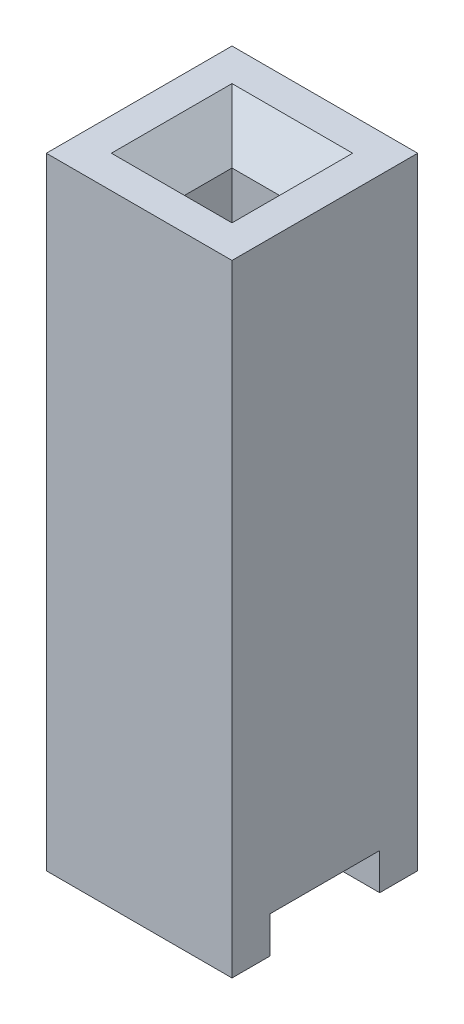
ISO-10303-21;
HEADER;
FILE_DESCRIPTION(('STEP AP214'),'2;1');
FILE_NAME('part.step','',(''),(''),'','','');
FILE_SCHEMA(('AUTOMOTIVE_DESIGN { 1 0 10303 214 1 1 1 1 }'));
ENDSEC;
DATA;
#1=APPLICATION_CONTEXT('core data for automotive mechanical design processes');
#2=APPLICATION_PROTOCOL_DEFINITION('international standard','automotive_design',2000,#1);
#3=PRODUCT_CONTEXT('',#1,'mechanical');
#4=PRODUCT('Part','Part','',(#3));
#5=PRODUCT_RELATED_PRODUCT_CATEGORY('part','',(#4));
#6=PRODUCT_DEFINITION_FORMATION('','',#4);
#7=PRODUCT_DEFINITION_CONTEXT('part definition',#1,'design');
#8=PRODUCT_DEFINITION('design','',#6,#7);
#9=PRODUCT_DEFINITION_SHAPE('','',#8);
#10=(LENGTH_UNIT() NAMED_UNIT(*) SI_UNIT(.MILLI.,.METRE.));
#11=(NAMED_UNIT(*) PLANE_ANGLE_UNIT() SI_UNIT($,.RADIAN.));
#12=(NAMED_UNIT(*) SI_UNIT($,.STERADIAN.) SOLID_ANGLE_UNIT());
#13=UNCERTAINTY_MEASURE_WITH_UNIT(LENGTH_MEASURE(1.E-05),#10,'distance_accuracy_value','');
#14=(GEOMETRIC_REPRESENTATION_CONTEXT(3) GLOBAL_UNCERTAINTY_ASSIGNED_CONTEXT((#13)) GLOBAL_UNIT_ASSIGNED_CONTEXT((#10,
#11,#12)) REPRESENTATION_CONTEXT('',''));
#15=CARTESIAN_POINT('',(0.,0.,0.));
#16=DIRECTION('',(0.,0.,1.));
#17=DIRECTION('',(1.,0.,0.));
#18=AXIS2_PLACEMENT_3D('',#15,#16,#17);
#19=CARTESIAN_POINT('',(-1.27,8.5,-1.27));
#20=DIRECTION('',(1.,0.,0.));
#21=DIRECTION('',(0.,0.,-1.));
#22=AXIS2_PLACEMENT_3D('',#19,#20,#21);
#23=PLANE('',#22);
#24=DIRECTION('',(0.,-1.,0.));
#25=VECTOR('',#24,1.);
#26=CARTESIAN_POINT('',(-1.27,8.5,-0.75));
#27=LINE('',#26,#25);
#28=CARTESIAN_POINT('',(-1.27,0.5,-0.75));
#29=VERTEX_POINT('',#28);
#30=CARTESIAN_POINT('',(-1.27,0.,-0.75));
#31=VERTEX_POINT('',#30);
#32=EDGE_CURVE('E200',#29,#31,#27,.T.);
#33=ORIENTED_EDGE('',*,*,#32,.F.);
#34=DIRECTION('',(0.,0.,1.));
#35=VECTOR('',#34,1.);
#36=CARTESIAN_POINT('',(-1.27,0.5,-1.27));
#37=LINE('',#36,#35);
#38=CARTESIAN_POINT('',(-1.27,0.5,0.75));
#39=VERTEX_POINT('',#38);
#40=EDGE_CURVE('E202',#29,#39,#37,.T.);
#41=ORIENTED_EDGE('',*,*,#40,.T.);
#42=DIRECTION('',(0.,1.,0.));
#43=VECTOR('',#42,1.);
#44=CARTESIAN_POINT('',(-1.27,8.5,0.75));
#45=LINE('',#44,#43);
#46=CARTESIAN_POINT('',(-1.27,0.,0.75));
#47=VERTEX_POINT('',#46);
#48=EDGE_CURVE('E195',#47,#39,#45,.T.);
#49=ORIENTED_EDGE('',*,*,#48,.F.);
#50=DIRECTION('',(0.,0.,1.));
#51=VECTOR('',#50,1.);
#52=CARTESIAN_POINT('',(-1.27,0.,-1.27));
#53=LINE('',#52,#51);
#54=CARTESIAN_POINT('',(-1.27,0.,1.27));
#55=VERTEX_POINT('',#54);
#56=EDGE_CURVE('E205',#47,#55,#53,.T.);
#57=ORIENTED_EDGE('',*,*,#56,.T.);
#58=DIRECTION('',(0.,-1.,0.));
#59=VECTOR('',#58,1.);
#60=CARTESIAN_POINT('',(-1.27,8.5,1.27));
#61=LINE('',#60,#59);
#62=CARTESIAN_POINT('',(-1.27,8.5,1.27));
#63=VERTEX_POINT('',#62);
#64=EDGE_CURVE('E237',#63,#55,#61,.T.);
#65=ORIENTED_EDGE('',*,*,#64,.F.);
#66=DIRECTION('',(0.,0.,1.));
#67=VECTOR('',#66,1.);
#68=CARTESIAN_POINT('',(-1.27,8.5,-1.27));
#69=LINE('',#68,#67);
#70=CARTESIAN_POINT('',(-1.27,8.5,-1.27));
#71=VERTEX_POINT('',#70);
#72=EDGE_CURVE('E206',#71,#63,#69,.T.);
#73=ORIENTED_EDGE('',*,*,#72,.F.);
#74=DIRECTION('',(0.,-1.,0.));
#75=VECTOR('',#74,1.);
#76=CARTESIAN_POINT('',(-1.27,8.5,-1.27));
#77=LINE('',#76,#75);
#78=CARTESIAN_POINT('',(-1.27,0.,-1.27));
#79=VERTEX_POINT('',#78);
#80=EDGE_CURVE('E218',#71,#79,#77,.T.);
#81=ORIENTED_EDGE('',*,*,#80,.T.);
#82=EDGE_CURVE('E219',#79,#31,#53,.T.);
#83=ORIENTED_EDGE('',*,*,#82,.T.);
#84=EDGE_LOOP('',(#33,#41,#49,#57,#65,#73,#81,#83));
#85=FACE_BOUND('',#84,.T.);
#86=ADVANCED_FACE('F51',(#85),#23,.F.);
#87=CARTESIAN_POINT('',(1.27,8.5,-1.27));
#88=DIRECTION('',(1.,0.,0.));
#89=DIRECTION('',(0.,0.,-1.));
#90=AXIS2_PLACEMENT_3D('',#87,#88,#89);
#91=PLANE('',#90);
#92=DIRECTION('',(0.,0.,1.));
#93=VECTOR('',#92,1.);
#94=CARTESIAN_POINT('',(1.27,0.5,-1.27));
#95=LINE('',#94,#93);
#96=CARTESIAN_POINT('',(1.27,0.5,-0.75));
#97=VERTEX_POINT('',#96);
#98=CARTESIAN_POINT('',(1.27,0.5,0.75));
#99=VERTEX_POINT('',#98);
#100=EDGE_CURVE('E244',#97,#99,#95,.T.);
#101=ORIENTED_EDGE('',*,*,#100,.F.);
#102=DIRECTION('',(0.,-1.,0.));
#103=VECTOR('',#102,1.);
#104=CARTESIAN_POINT('',(1.27,8.5,-0.75));
#105=LINE('',#104,#103);
#106=CARTESIAN_POINT('',(1.27,0.,-0.75));
#107=VERTEX_POINT('',#106);
#108=EDGE_CURVE('E197',#97,#107,#105,.T.);
#109=ORIENTED_EDGE('',*,*,#108,.T.);
#110=DIRECTION('',(0.,0.,1.));
#111=VECTOR('',#110,1.);
#112=CARTESIAN_POINT('',(1.27,0.,-1.27));
#113=LINE('',#112,#111);
#114=CARTESIAN_POINT('',(1.27,0.,-1.27));
#115=VERTEX_POINT('',#114);
#116=EDGE_CURVE('E226',#115,#107,#113,.T.);
#117=ORIENTED_EDGE('',*,*,#116,.F.);
#118=DIRECTION('',(0.,-1.,0.));
#119=VECTOR('',#118,1.);
#120=CARTESIAN_POINT('',(1.27,8.5,-1.27));
#121=LINE('',#120,#119);
#122=CARTESIAN_POINT('',(1.27,8.5,-1.27));
#123=VERTEX_POINT('',#122);
#124=EDGE_CURVE('E232',#123,#115,#121,.T.);
#125=ORIENTED_EDGE('',*,*,#124,.F.);
#126=DIRECTION('',(0.,0.,1.));
#127=VECTOR('',#126,1.);
#128=CARTESIAN_POINT('',(1.27,8.5,-1.27));
#129=LINE('',#128,#127);
#130=CARTESIAN_POINT('',(1.27,8.5,1.27));
#131=VERTEX_POINT('',#130);
#132=EDGE_CURVE('E212',#123,#131,#129,.T.);
#133=ORIENTED_EDGE('',*,*,#132,.T.);
#134=DIRECTION('',(0.,-1.,0.));
#135=VECTOR('',#134,1.);
#136=CARTESIAN_POINT('',(1.27,8.5,1.27));
#137=LINE('',#136,#135);
#138=CARTESIAN_POINT('',(1.27,0.,1.27));
#139=VERTEX_POINT('',#138);
#140=EDGE_CURVE('E234',#131,#139,#137,.T.);
#141=ORIENTED_EDGE('',*,*,#140,.T.);
#142=CARTESIAN_POINT('',(1.27,0.,0.75));
#143=VERTEX_POINT('',#142);
#144=EDGE_CURVE('E225',#143,#139,#113,.T.);
#145=ORIENTED_EDGE('',*,*,#144,.F.);
#146=DIRECTION('',(0.,1.,0.));
#147=VECTOR('',#146,1.);
#148=CARTESIAN_POINT('',(1.27,8.5,0.75));
#149=LINE('',#148,#147);
#150=EDGE_CURVE('E192',#143,#99,#149,.T.);
#151=ORIENTED_EDGE('',*,*,#150,.T.);
#152=EDGE_LOOP('',(#101,#109,#117,#125,#133,#141,#145,#151));
#153=FACE_BOUND('',#152,.T.);
#154=ADVANCED_FACE('F287',(#153),#91,.T.);
#155=CARTESIAN_POINT('',(0.,0.,0.));
#156=DIRECTION('',(0.,1.,0.));
#157=DIRECTION('',(0.,0.,1.));
#158=AXIS2_PLACEMENT_3D('',#155,#156,#157);
#159=PLANE('',#158);
#160=DIRECTION('',(1.,0.,0.));
#161=VECTOR('',#160,1.);
#162=CARTESIAN_POINT('',(0.,0.,-0.75));
#163=LINE('',#162,#161);
#164=EDGE_CURVE('E242',#31,#107,#163,.T.);
#165=ORIENTED_EDGE('',*,*,#164,.F.);
#166=ORIENTED_EDGE('',*,*,#82,.F.);
#167=DIRECTION('',(1.,0.,0.));
#168=VECTOR('',#167,1.);
#169=CARTESIAN_POINT('',(-1.27,0.,-1.27));
#170=LINE('',#169,#168);
#171=EDGE_CURVE('E210',#79,#115,#170,.T.);
#172=ORIENTED_EDGE('',*,*,#171,.T.);
#173=ORIENTED_EDGE('',*,*,#116,.T.);
#174=EDGE_LOOP('',(#165,#166,#172,#173));
#175=FACE_BOUND('',#174,.T.);
#176=ADVANCED_FACE('F293',(#175),#159,.F.);
#177=DIRECTION('',(-1.,0.,0.));
#178=VECTOR('',#177,1.);
#179=CARTESIAN_POINT('',(0.,0.,0.75));
#180=LINE('',#179,#178);
#181=EDGE_CURVE('E240',#143,#47,#180,.T.);
#182=ORIENTED_EDGE('',*,*,#181,.F.);
#183=ORIENTED_EDGE('',*,*,#144,.T.);
#184=DIRECTION('',(1.,0.,0.));
#185=VECTOR('',#184,1.);
#186=CARTESIAN_POINT('',(-1.27,0.,1.27));
#187=LINE('',#186,#185);
#188=EDGE_CURVE('E222',#55,#139,#187,.T.);
#189=ORIENTED_EDGE('',*,*,#188,.F.);
#190=ORIENTED_EDGE('',*,*,#56,.F.);
#191=EDGE_LOOP('',(#182,#183,#189,#190));
#192=FACE_BOUND('',#191,.T.);
#193=ADVANCED_FACE('F413',(#192),#159,.F.);
#194=CARTESIAN_POINT('',(-1.27,8.5,1.27));
#195=DIRECTION('',(0.,0.,-1.));
#196=DIRECTION('',(-1.,0.,0.));
#197=AXIS2_PLACEMENT_3D('',#194,#195,#196);
#198=PLANE('',#197);
#199=ORIENTED_EDGE('',*,*,#188,.T.);
#200=ORIENTED_EDGE('',*,*,#140,.F.);
#201=DIRECTION('',(1.,0.,0.));
#202=VECTOR('',#201,1.);
#203=CARTESIAN_POINT('',(-1.27,8.5,1.27));
#204=LINE('',#203,#202);
#205=EDGE_CURVE('E209',#63,#131,#204,.T.);
#206=ORIENTED_EDGE('',*,*,#205,.F.);
#207=ORIENTED_EDGE('',*,*,#64,.T.);
#208=EDGE_LOOP('',(#199,#200,#206,#207));
#209=FACE_BOUND('',#208,.T.);
#210=ADVANCED_FACE('F299',(#209),#198,.F.);
#211=CARTESIAN_POINT('',(-1.27,8.5,-1.27));
#212=DIRECTION('',(0.,0.,-1.));
#213=DIRECTION('',(-1.,0.,0.));
#214=AXIS2_PLACEMENT_3D('',#211,#212,#213);
#215=PLANE('',#214);
#216=ORIENTED_EDGE('',*,*,#171,.F.);
#217=ORIENTED_EDGE('',*,*,#80,.F.);
#218=DIRECTION('',(1.,0.,0.));
#219=VECTOR('',#218,1.);
#220=CARTESIAN_POINT('',(-1.27,8.5,-1.27));
#221=LINE('',#220,#219);
#222=EDGE_CURVE('E215',#71,#123,#221,.T.);
#223=ORIENTED_EDGE('',*,*,#222,.T.);
#224=ORIENTED_EDGE('',*,*,#124,.T.);
#225=EDGE_LOOP('',(#216,#217,#223,#224));
#226=FACE_BOUND('',#225,.T.);
#227=ADVANCED_FACE('F406',(#226),#215,.T.);
#228=CARTESIAN_POINT('',(0.,8.5,0.));
#229=DIRECTION('',(0.,1.,0.));
#230=DIRECTION('',(0.,0.,1.));
#231=AXIS2_PLACEMENT_3D('',#228,#229,#230);
#232=PLANE('',#231);
#233=DIRECTION('',(1.,0.,0.));
#234=VECTOR('',#233,1.);
#235=CARTESIAN_POINT('',(0.325,8.5,-0.825000000000002));
#236=LINE('',#235,#234);
#237=CARTESIAN_POINT('',(-0.825000000000002,8.5,-0.825000000000002));
#238=VERTEX_POINT('',#237);
#239=CARTESIAN_POINT('',(0.825000000000002,8.5,-0.825000000000002));
#240=VERTEX_POINT('',#239);
#241=EDGE_CURVE('E251',#238,#240,#236,.T.);
#242=ORIENTED_EDGE('',*,*,#241,.T.);
#243=DIRECTION('',(0.,0.,1.));
#244=VECTOR('',#243,1.);
#245=CARTESIAN_POINT('',(0.825000000000002,8.5,0.325));
#246=LINE('',#245,#244);
#247=CARTESIAN_POINT('',(0.825000000000002,8.5,0.825000000000002));
#248=VERTEX_POINT('',#247);
#249=EDGE_CURVE('E253',#240,#248,#246,.T.);
#250=ORIENTED_EDGE('',*,*,#249,.T.);
#251=DIRECTION('',(-1.,0.,0.));
#252=VECTOR('',#251,1.);
#253=CARTESIAN_POINT('',(-0.325,8.5,0.825000000000002));
#254=LINE('',#253,#252);
#255=CARTESIAN_POINT('',(-0.825000000000002,8.5,0.825000000000002));
#256=VERTEX_POINT('',#255);
#257=EDGE_CURVE('E247',#248,#256,#254,.T.);
#258=ORIENTED_EDGE('',*,*,#257,.T.);
#259=DIRECTION('',(0.,0.,-1.));
#260=VECTOR('',#259,1.);
#261=CARTESIAN_POINT('',(-0.825000000000002,8.5,-0.325));
#262=LINE('',#261,#260);
#263=EDGE_CURVE('E249',#256,#238,#262,.T.);
#264=ORIENTED_EDGE('',*,*,#263,.T.);
#265=EDGE_LOOP('',(#242,#250,#258,#264));
#266=FACE_BOUND('',#265,.T.);
#267=ORIENTED_EDGE('',*,*,#72,.T.);
#268=ORIENTED_EDGE('',*,*,#205,.T.);
#269=ORIENTED_EDGE('',*,*,#132,.F.);
#270=ORIENTED_EDGE('',*,*,#222,.F.);
#271=EDGE_LOOP('',(#267,#268,#269,#270));
#272=FACE_BOUND('',#271,.T.);
#273=ADVANCED_FACE('F375',(#266,#272),#232,.T.);
#274=CARTESIAN_POINT('',(0.,0.5,0.));
#275=DIRECTION('',(0.,1.,0.));
#276=DIRECTION('',(0.,0.,1.));
#277=AXIS2_PLACEMENT_3D('',#274,#275,#276);
#278=PLANE('',#277);
#279=DIRECTION('',(-1.,0.,0.));
#280=VECTOR('',#279,1.);
#281=CARTESIAN_POINT('',(-1.5,0.5,-0.75));
#282=LINE('',#281,#280);
#283=EDGE_CURVE('E183',#97,#29,#282,.T.);
#284=ORIENTED_EDGE('',*,*,#283,.F.);
#285=ORIENTED_EDGE('',*,*,#100,.T.);
#286=DIRECTION('',(1.,0.,0.));
#287=VECTOR('',#286,1.);
#288=CARTESIAN_POINT('',(-1.5,0.5,0.75));
#289=LINE('',#288,#287);
#290=EDGE_CURVE('E189',#39,#99,#289,.T.);
#291=ORIENTED_EDGE('',*,*,#290,.F.);
#292=ORIENTED_EDGE('',*,*,#40,.F.);
#293=EDGE_LOOP('',(#284,#285,#291,#292));
#294=FACE_BOUND('',#293,.T.);
#295=ADVANCED_FACE('F369',(#294),#278,.F.);
#296=CARTESIAN_POINT('',(-1.5,0.5,-0.75));
#297=DIRECTION('',(0.,0.,1.));
#298=DIRECTION('',(1.,0.,0.));
#299=AXIS2_PLACEMENT_3D('',#296,#297,#298);
#300=PLANE('',#299);
#301=ORIENTED_EDGE('',*,*,#32,.T.);
#302=ORIENTED_EDGE('',*,*,#164,.T.);
#303=ORIENTED_EDGE('',*,*,#108,.F.);
#304=ORIENTED_EDGE('',*,*,#283,.T.);
#305=EDGE_LOOP('',(#301,#302,#303,#304));
#306=FACE_BOUND('',#305,.T.);
#307=ADVANCED_FACE('F374',(#306),#300,.T.);
#308=CARTESIAN_POINT('',(-1.5,0.5,0.75));
#309=DIRECTION('',(0.,0.,-1.));
#310=DIRECTION('',(-1.,0.,0.));
#311=AXIS2_PLACEMENT_3D('',#308,#309,#310);
#312=PLANE('',#311);
#313=ORIENTED_EDGE('',*,*,#48,.T.);
#314=ORIENTED_EDGE('',*,*,#290,.T.);
#315=ORIENTED_EDGE('',*,*,#150,.F.);
#316=ORIENTED_EDGE('',*,*,#181,.T.);
#317=EDGE_LOOP('',(#313,#314,#315,#316));
#318=FACE_BOUND('',#317,.T.);
#319=ADVANCED_FACE('F365',(#318),#312,.T.);
#320=CARTESIAN_POINT('',(0.325,1.5,0.325));
#321=DIRECTION('',(1.,0.,0.));
#322=DIRECTION('',(0.,0.,-1.));
#323=AXIS2_PLACEMENT_3D('',#320,#321,#322);
#324=PLANE('',#323);
#325=DIRECTION('',(0.,1.,0.));
#326=VECTOR('',#325,1.);
#327=CARTESIAN_POINT('',(0.325,1.5,0.325));
#328=LINE('',#327,#326);
#329=CARTESIAN_POINT('',(0.325,1.5,0.325));
#330=VERTEX_POINT('',#329);
#331=CARTESIAN_POINT('',(0.325,8.,0.325));
#332=VERTEX_POINT('',#331);
#333=EDGE_CURVE('E181',#330,#332,#328,.T.);
#334=ORIENTED_EDGE('',*,*,#333,.T.);
#335=DIRECTION('',(0.,0.,-1.));
#336=VECTOR('',#335,1.);
#337=CARTESIAN_POINT('',(0.325,8.,-0.325));
#338=LINE('',#337,#336);
#339=CARTESIAN_POINT('',(0.325,8.,-0.325));
#340=VERTEX_POINT('',#339);
#341=EDGE_CURVE('E161',#332,#340,#338,.T.);
#342=ORIENTED_EDGE('',*,*,#341,.T.);
#343=DIRECTION('',(0.,1.,0.));
#344=VECTOR('',#343,1.);
#345=CARTESIAN_POINT('',(0.325,1.5,-0.325));
#346=LINE('',#345,#344);
#347=CARTESIAN_POINT('',(0.325,1.5,-0.325));
#348=VERTEX_POINT('',#347);
#349=EDGE_CURVE('E153',#348,#340,#346,.T.);
#350=ORIENTED_EDGE('',*,*,#349,.F.);
#351=DIRECTION('',(0.,0.,-1.));
#352=VECTOR('',#351,1.);
#353=CARTESIAN_POINT('',(0.325,1.5,0.325));
#354=LINE('',#353,#352);
#355=EDGE_CURVE('E158',#330,#348,#354,.T.);
#356=ORIENTED_EDGE('',*,*,#355,.F.);
#357=EDGE_LOOP('',(#334,#342,#350,#356));
#358=FACE_BOUND('',#357,.T.);
#359=ADVANCED_FACE('F156',(#358),#324,.F.);
#360=CARTESIAN_POINT('',(-0.325,1.5,0.325));
#361=DIRECTION('',(0.,0.,1.));
#362=DIRECTION('',(1.,0.,0.));
#363=AXIS2_PLACEMENT_3D('',#360,#361,#362);
#364=PLANE('',#363);
#365=DIRECTION('',(0.,1.,0.));
#366=VECTOR('',#365,1.);
#367=CARTESIAN_POINT('',(-0.325,1.5,0.325));
#368=LINE('',#367,#366);
#369=CARTESIAN_POINT('',(-0.325,1.5,0.325));
#370=VERTEX_POINT('',#369);
#371=CARTESIAN_POINT('',(-0.325,8.,0.325));
#372=VERTEX_POINT('',#371);
#373=EDGE_CURVE('E184',#370,#372,#368,.T.);
#374=ORIENTED_EDGE('',*,*,#373,.T.);
#375=DIRECTION('',(1.,0.,0.));
#376=VECTOR('',#375,1.);
#377=CARTESIAN_POINT('',(0.325,8.,0.325));
#378=LINE('',#377,#376);
#379=EDGE_CURVE('E12',#372,#332,#378,.T.);
#380=ORIENTED_EDGE('',*,*,#379,.T.);
#381=ORIENTED_EDGE('',*,*,#333,.F.);
#382=DIRECTION('',(1.,0.,0.));
#383=VECTOR('',#382,1.);
#384=CARTESIAN_POINT('',(-0.325,1.5,0.325));
#385=LINE('',#384,#383);
#386=EDGE_CURVE('E163',#370,#330,#385,.T.);
#387=ORIENTED_EDGE('',*,*,#386,.F.);
#388=EDGE_LOOP('',(#374,#380,#381,#387));
#389=FACE_BOUND('',#388,.T.);
#390=ADVANCED_FACE('F276',(#389),#364,.F.);
#391=CARTESIAN_POINT('',(-0.325,1.5,0.325));
#392=DIRECTION('',(-1.,0.,0.));
#393=DIRECTION('',(0.,0.,1.));
#394=AXIS2_PLACEMENT_3D('',#391,#392,#393);
#395=PLANE('',#394);
#396=DIRECTION('',(0.,1.,0.));
#397=VECTOR('',#396,1.);
#398=CARTESIAN_POINT('',(-0.325,1.5,-0.325));
#399=LINE('',#398,#397);
#400=CARTESIAN_POINT('',(-0.325,1.5,-0.325));
#401=VERTEX_POINT('',#400);
#402=CARTESIAN_POINT('',(-0.325,8.,-0.325));
#403=VERTEX_POINT('',#402);
#404=EDGE_CURVE('E162',#401,#403,#399,.T.);
#405=ORIENTED_EDGE('',*,*,#404,.T.);
#406=DIRECTION('',(0.,0.,1.));
#407=VECTOR('',#406,1.);
#408=CARTESIAN_POINT('',(-0.325,8.,0.325));
#409=LINE('',#408,#407);
#410=EDGE_CURVE('E60',#403,#372,#409,.T.);
#411=ORIENTED_EDGE('',*,*,#410,.T.);
#412=ORIENTED_EDGE('',*,*,#373,.F.);
#413=DIRECTION('',(0.,0.,1.));
#414=VECTOR('',#413,1.);
#415=CARTESIAN_POINT('',(-0.325,1.5,0.325));
#416=LINE('',#415,#414);
#417=EDGE_CURVE('E171',#401,#370,#416,.T.);
#418=ORIENTED_EDGE('',*,*,#417,.F.);
#419=EDGE_LOOP('',(#405,#411,#412,#418));
#420=FACE_BOUND('',#419,.T.);
#421=ADVANCED_FACE('F277',(#420),#395,.F.);
#422=CARTESIAN_POINT('',(-0.325,1.5,-0.325));
#423=DIRECTION('',(0.,0.,-1.));
#424=DIRECTION('',(-1.,0.,0.));
#425=AXIS2_PLACEMENT_3D('',#422,#423,#424);
#426=PLANE('',#425);
#427=ORIENTED_EDGE('',*,*,#349,.T.);
#428=DIRECTION('',(-1.,0.,0.));
#429=VECTOR('',#428,1.);
#430=CARTESIAN_POINT('',(-0.325,8.,-0.325));
#431=LINE('',#430,#429);
#432=EDGE_CURVE('E75',#340,#403,#431,.T.);
#433=ORIENTED_EDGE('',*,*,#432,.T.);
#434=ORIENTED_EDGE('',*,*,#404,.F.);
#435=DIRECTION('',(-1.,0.,0.));
#436=VECTOR('',#435,1.);
#437=CARTESIAN_POINT('',(-0.325,1.5,-0.325));
#438=LINE('',#437,#436);
#439=EDGE_CURVE('E166',#348,#401,#438,.T.);
#440=ORIENTED_EDGE('',*,*,#439,.F.);
#441=EDGE_LOOP('',(#427,#433,#434,#440));
#442=FACE_BOUND('',#441,.T.);
#443=ADVANCED_FACE('F167',(#442),#426,.F.);
#444=CARTESIAN_POINT('',(0.,1.5,0.));
#445=DIRECTION('',(0.,-1.,0.));
#446=DIRECTION('',(0.,0.,-1.));
#447=AXIS2_PLACEMENT_3D('',#444,#445,#446);
#448=PLANE('',#447);
#449=ORIENTED_EDGE('',*,*,#355,.T.);
#450=ORIENTED_EDGE('',*,*,#439,.T.);
#451=ORIENTED_EDGE('',*,*,#417,.T.);
#452=ORIENTED_EDGE('',*,*,#386,.T.);
#453=EDGE_LOOP('',(#449,#450,#451,#452));
#454=FACE_BOUND('',#453,.T.);
#455=ADVANCED_FACE('F173',(#454),#448,.F.);
#456=CARTESIAN_POINT('',(-0.325,8.,0.325));
#457=DIRECTION('',(0.707106781186546,0.707106781186549,0.));
#458=DIRECTION('',(0.,0.,-1.));
#459=AXIS2_PLACEMENT_3D('',#456,#457,#458);
#460=PLANE('',#459);
#461=DIRECTION('',(-0.577350269189626,0.577350269189624,-0.577350269189626));
#462=VECTOR('',#461,1.);
#463=CARTESIAN_POINT('',(-0.325,8.,-0.325));
#464=LINE('',#463,#462);
#465=EDGE_CURVE('E177',#238,#403,#464,.F.);
#466=ORIENTED_EDGE('',*,*,#465,.F.);
#467=ORIENTED_EDGE('',*,*,#263,.F.);
#468=DIRECTION('',(-0.577350269189626,0.577350269189624,0.577350269189626));
#469=VECTOR('',#468,1.);
#470=CARTESIAN_POINT('',(-0.325,8.,0.325));
#471=LINE('',#470,#469);
#472=EDGE_CURVE('E55',#372,#256,#471,.T.);
#473=ORIENTED_EDGE('',*,*,#472,.F.);
#474=ORIENTED_EDGE('',*,*,#410,.F.);
#475=EDGE_LOOP('',(#466,#467,#473,#474));
#476=FACE_BOUND('',#475,.T.);
#477=ADVANCED_FACE('F53',(#476),#460,.T.);
#478=CARTESIAN_POINT('',(-0.325,8.,0.325));
#479=DIRECTION('',(0.,0.707106781186549,-0.707106781186546));
#480=DIRECTION('',(-1.,0.,0.));
#481=AXIS2_PLACEMENT_3D('',#478,#479,#480);
#482=PLANE('',#481);
#483=ORIENTED_EDGE('',*,*,#472,.T.);
#484=ORIENTED_EDGE('',*,*,#257,.F.);
#485=DIRECTION('',(-0.577350269189626,-0.577350269189624,-0.577350269189626));
#486=VECTOR('',#485,1.);
#487=CARTESIAN_POINT('',(0.325,8.,0.325));
#488=LINE('',#487,#486);
#489=EDGE_CURVE('E260',#332,#248,#488,.F.);
#490=ORIENTED_EDGE('',*,*,#489,.F.);
#491=ORIENTED_EDGE('',*,*,#379,.F.);
#492=EDGE_LOOP('',(#483,#484,#490,#491));
#493=FACE_BOUND('',#492,.T.);
#494=ADVANCED_FACE('F274',(#493),#482,.T.);
#495=CARTESIAN_POINT('',(-0.325,8.,-0.325));
#496=DIRECTION('',(0.,0.707106781186549,0.707106781186546));
#497=DIRECTION('',(1.,0.,0.));
#498=AXIS2_PLACEMENT_3D('',#495,#496,#497);
#499=PLANE('',#498);
#500=ORIENTED_EDGE('',*,*,#465,.T.);
#501=ORIENTED_EDGE('',*,*,#432,.F.);
#502=DIRECTION('',(0.577350269189626,0.577350269189624,-0.577350269189626));
#503=VECTOR('',#502,1.);
#504=CARTESIAN_POINT('',(0.108333333333333,7.78333333333333,-0.108333333333333));
#505=LINE('',#504,#503);
#506=EDGE_CURVE('E258',#240,#340,#505,.F.);
#507=ORIENTED_EDGE('',*,*,#506,.F.);
#508=ORIENTED_EDGE('',*,*,#241,.F.);
#509=EDGE_LOOP('',(#500,#501,#507,#508));
#510=FACE_BOUND('',#509,.T.);
#511=ADVANCED_FACE('F265',(#510),#499,.T.);
#512=CARTESIAN_POINT('',(0.325,8.,0.325));
#513=DIRECTION('',(-0.707106781186546,0.707106781186549,0.));
#514=DIRECTION('',(0.,0.,1.));
#515=AXIS2_PLACEMENT_3D('',#512,#513,#514);
#516=PLANE('',#515);
#517=ORIENTED_EDGE('',*,*,#489,.T.);
#518=ORIENTED_EDGE('',*,*,#249,.F.);
#519=ORIENTED_EDGE('',*,*,#506,.T.);
#520=ORIENTED_EDGE('',*,*,#341,.F.);
#521=EDGE_LOOP('',(#517,#518,#519,#520));
#522=FACE_BOUND('',#521,.T.);
#523=ADVANCED_FACE('F300',(#522),#516,.T.);
#524=CLOSED_SHELL('',(#86,#154,#176,#193,#210,#227,#273,#295,#307,#319,#359,#390,#421,#443,#455,
#477,#494,#511,#523));
#525=MANIFOLD_SOLID_BREP('B2',#524);
#526=CARTESIAN_POINT('',(-0.3,-0.2,-0.3));
#527=DIRECTION('',(1.,0.,0.));
#528=DIRECTION('',(0.,0.,-1.));
#529=AXIS2_PLACEMENT_3D('',#526,#527,#528);
#530=PLANE('',#529);
#531=DIRECTION('',(0.,0.,-1.));
#532=VECTOR('',#531,1.);
#533=CARTESIAN_POINT('',(-0.3,0.5,-0.3));
#534=LINE('',#533,#532);
#535=CARTESIAN_POINT('',(-0.3,0.5,0.3));
#536=VERTEX_POINT('',#535);
#537=CARTESIAN_POINT('',(-0.3,0.5,-0.3));
#538=VERTEX_POINT('',#537);
#539=EDGE_CURVE('E547',#536,#538,#534,.T.);
#540=ORIENTED_EDGE('',*,*,#539,.T.);
#541=DIRECTION('',(0.,1.,0.));
#542=VECTOR('',#541,1.);
#543=CARTESIAN_POINT('',(-0.3,-0.2,-0.3));
#544=LINE('',#543,#542);
#545=CARTESIAN_POINT('',(-0.3,-0.2,-0.3));
#546=VERTEX_POINT('',#545);
#547=EDGE_CURVE('E49',#546,#538,#544,.T.);
#548=ORIENTED_EDGE('',*,*,#547,.F.);
#549=DIRECTION('',(0.,0.,-1.));
#550=VECTOR('',#549,1.);
#551=CARTESIAN_POINT('',(-0.3,-0.2,-0.3));
#552=LINE('',#551,#550);
#553=CARTESIAN_POINT('',(-0.3,-0.2,0.3));
#554=VERTEX_POINT('',#553);
#555=EDGE_CURVE('E535',#554,#546,#552,.T.);
#556=ORIENTED_EDGE('',*,*,#555,.F.);
#557=DIRECTION('',(0.,1.,0.));
#558=VECTOR('',#557,1.);
#559=CARTESIAN_POINT('',(-0.3,-0.2,0.3));
#560=LINE('',#559,#558);
#561=EDGE_CURVE('E543',#554,#536,#560,.T.);
#562=ORIENTED_EDGE('',*,*,#561,.T.);
#563=EDGE_LOOP('',(#540,#548,#556,#562));
#564=FACE_BOUND('',#563,.T.);
#565=ADVANCED_FACE('F484',(#564),#530,.F.);
#566=CARTESIAN_POINT('',(0.3,-0.2,-0.3));
#567=DIRECTION('',(0.,0.,1.));
#568=DIRECTION('',(1.,0.,0.));
#569=AXIS2_PLACEMENT_3D('',#566,#567,#568);
#570=PLANE('',#569);
#571=DIRECTION('',(1.,0.,0.));
#572=VECTOR('',#571,1.);
#573=CARTESIAN_POINT('',(0.3,0.5,-0.3));
#574=LINE('',#573,#572);
#575=CARTESIAN_POINT('',(0.3,0.5,-0.3));
#576=VERTEX_POINT('',#575);
#577=EDGE_CURVE('E539',#538,#576,#574,.T.);
#578=ORIENTED_EDGE('',*,*,#577,.T.);
#579=DIRECTION('',(0.,1.,0.));
#580=VECTOR('',#579,1.);
#581=CARTESIAN_POINT('',(0.3,-0.2,-0.3));
#582=LINE('',#581,#580);
#583=CARTESIAN_POINT('',(0.3,-0.2,-0.3));
#584=VERTEX_POINT('',#583);
#585=EDGE_CURVE('E492',#584,#576,#582,.T.);
#586=ORIENTED_EDGE('',*,*,#585,.F.);
#587=DIRECTION('',(1.,0.,0.));
#588=VECTOR('',#587,1.);
#589=CARTESIAN_POINT('',(0.3,-0.2,-0.3));
#590=LINE('',#589,#588);
#591=EDGE_CURVE('E530',#546,#584,#590,.T.);
#592=ORIENTED_EDGE('',*,*,#591,.F.);
#593=ORIENTED_EDGE('',*,*,#547,.T.);
#594=EDGE_LOOP('',(#578,#586,#592,#593));
#595=FACE_BOUND('',#594,.T.);
#596=ADVANCED_FACE('F538',(#595),#570,.F.);
#597=CARTESIAN_POINT('',(0.3,-0.2,-0.3));
#598=DIRECTION('',(-1.,0.,0.));
#599=DIRECTION('',(0.,0.,1.));
#600=AXIS2_PLACEMENT_3D('',#597,#598,#599);
#601=PLANE('',#600);
#602=DIRECTION('',(0.,0.,1.));
#603=VECTOR('',#602,1.);
#604=CARTESIAN_POINT('',(0.3,0.5,-0.3));
#605=LINE('',#604,#603);
#606=CARTESIAN_POINT('',(0.3,0.5,0.3));
#607=VERTEX_POINT('',#606);
#608=EDGE_CURVE('E517',#576,#607,#605,.T.);
#609=ORIENTED_EDGE('',*,*,#608,.T.);
#610=DIRECTION('',(0.,1.,0.));
#611=VECTOR('',#610,1.);
#612=CARTESIAN_POINT('',(0.3,-0.2,0.3));
#613=LINE('',#612,#611);
#614=CARTESIAN_POINT('',(0.3,-0.2,0.3));
#615=VERTEX_POINT('',#614);
#616=EDGE_CURVE('E540',#615,#607,#613,.T.);
#617=ORIENTED_EDGE('',*,*,#616,.F.);
#618=DIRECTION('',(0.,0.,1.));
#619=VECTOR('',#618,1.);
#620=CARTESIAN_POINT('',(0.3,-0.2,-0.3));
#621=LINE('',#620,#619);
#622=EDGE_CURVE('E533',#584,#615,#621,.T.);
#623=ORIENTED_EDGE('',*,*,#622,.F.);
#624=ORIENTED_EDGE('',*,*,#585,.T.);
#625=EDGE_LOOP('',(#609,#617,#623,#624));
#626=FACE_BOUND('',#625,.T.);
#627=ADVANCED_FACE('F541',(#626),#601,.F.);
#628=CARTESIAN_POINT('',(0.3,-0.2,0.3));
#629=DIRECTION('',(0.,0.,-1.));
#630=DIRECTION('',(-1.,0.,0.));
#631=AXIS2_PLACEMENT_3D('',#628,#629,#630);
#632=PLANE('',#631);
#633=DIRECTION('',(-1.,0.,0.));
#634=VECTOR('',#633,1.);
#635=CARTESIAN_POINT('',(0.3,0.5,0.3));
#636=LINE('',#635,#634);
#637=EDGE_CURVE('E523',#607,#536,#636,.T.);
#638=ORIENTED_EDGE('',*,*,#637,.T.);
#639=ORIENTED_EDGE('',*,*,#561,.F.);
#640=DIRECTION('',(-1.,0.,0.));
#641=VECTOR('',#640,1.);
#642=CARTESIAN_POINT('',(0.3,-0.2,0.3));
#643=LINE('',#642,#641);
#644=EDGE_CURVE('E500',#615,#554,#643,.T.);
#645=ORIENTED_EDGE('',*,*,#644,.F.);
#646=ORIENTED_EDGE('',*,*,#616,.T.);
#647=EDGE_LOOP('',(#638,#639,#645,#646));
#648=FACE_BOUND('',#647,.T.);
#649=ADVANCED_FACE('F554',(#648),#632,.F.);
#650=CARTESIAN_POINT('',(0.,-0.2,0.));
#651=DIRECTION('',(0.,-1.,0.));
#652=DIRECTION('',(0.,0.,-1.));
#653=AXIS2_PLACEMENT_3D('',#650,#651,#652);
#654=PLANE('',#653);
#655=ORIENTED_EDGE('',*,*,#555,.T.);
#656=ORIENTED_EDGE('',*,*,#591,.T.);
#657=ORIENTED_EDGE('',*,*,#622,.T.);
#658=ORIENTED_EDGE('',*,*,#644,.T.);
#659=EDGE_LOOP('',(#655,#656,#657,#658));
#660=FACE_BOUND('',#659,.T.);
#661=ADVANCED_FACE('F531',(#660),#654,.T.);
#662=CARTESIAN_POINT('',(0.,0.5,0.));
#663=DIRECTION('',(0.,-1.,0.));
#664=DIRECTION('',(0.,0.,-1.));
#665=AXIS2_PLACEMENT_3D('',#662,#663,#664);
#666=PLANE('',#665);
#667=ORIENTED_EDGE('',*,*,#539,.F.);
#668=ORIENTED_EDGE('',*,*,#637,.F.);
#669=ORIENTED_EDGE('',*,*,#608,.F.);
#670=ORIENTED_EDGE('',*,*,#577,.F.);
#671=EDGE_LOOP('',(#667,#668,#669,#670));
#672=FACE_BOUND('',#671,.T.);
#673=ADVANCED_FACE('F557',(#672),#666,.F.);
#674=CLOSED_SHELL('',(#565,#596,#627,#649,#661,#673));
#675=MANIFOLD_SOLID_BREP('B6',#674);
#676=ADVANCED_BREP_SHAPE_REPRESENTATION('',(#18,#525,#675),#14);
#677=SHAPE_DEFINITION_REPRESENTATION(#9,#676);
ENDSEC;
END-ISO-10303-21;
